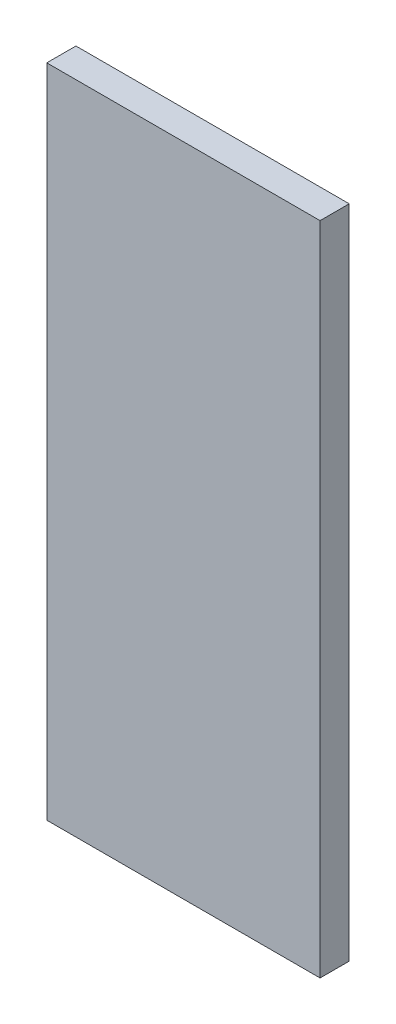
ISO-10303-21;
HEADER;
FILE_DESCRIPTION(('STEP AP214'),'2;1');
FILE_NAME('part.step','',(''),(''),'','','');
FILE_SCHEMA(('AUTOMOTIVE_DESIGN { 1 0 10303 214 1 1 1 1 }'));
ENDSEC;
DATA;
#1=APPLICATION_CONTEXT('core data for automotive mechanical design processes');
#2=APPLICATION_PROTOCOL_DEFINITION('international standard','automotive_design',2000,#1);
#3=PRODUCT_CONTEXT('',#1,'mechanical');
#4=PRODUCT('Part','Part','',(#3));
#5=PRODUCT_RELATED_PRODUCT_CATEGORY('part','',(#4));
#6=PRODUCT_DEFINITION_FORMATION('','',#4);
#7=PRODUCT_DEFINITION_CONTEXT('part definition',#1,'design');
#8=PRODUCT_DEFINITION('design','',#6,#7);
#9=PRODUCT_DEFINITION_SHAPE('','',#8);
#10=(LENGTH_UNIT() NAMED_UNIT(*) SI_UNIT(.MILLI.,.METRE.));
#11=(NAMED_UNIT(*) PLANE_ANGLE_UNIT() SI_UNIT($,.RADIAN.));
#12=(NAMED_UNIT(*) SI_UNIT($,.STERADIAN.) SOLID_ANGLE_UNIT());
#13=UNCERTAINTY_MEASURE_WITH_UNIT(LENGTH_MEASURE(1.E-05),#10,'distance_accuracy_value','');
#14=(GEOMETRIC_REPRESENTATION_CONTEXT(3) GLOBAL_UNCERTAINTY_ASSIGNED_CONTEXT((#13)) GLOBAL_UNIT_ASSIGNED_CONTEXT((#10,
#11,#12)) REPRESENTATION_CONTEXT('',''));
#15=CARTESIAN_POINT('',(0.,0.,0.));
#16=DIRECTION('',(0.,0.,1.));
#17=DIRECTION('',(1.,0.,0.));
#18=AXIS2_PLACEMENT_3D('',#15,#16,#17);
#19=CARTESIAN_POINT('',(0.,0.,-8.00000000000001));
#20=DIRECTION('',(-1.,0.,0.));
#21=DIRECTION('',(0.,-1.,0.));
#22=AXIS2_PLACEMENT_3D('',#19,#20,#21);
#23=PLANE('',#22);
#24=DIRECTION('',(0.,-1.,0.));
#25=VECTOR('',#24,1.);
#26=CARTESIAN_POINT('',(0.,0.,0.));
#27=LINE('',#26,#25);
#28=CARTESIAN_POINT('',(0.,0.,0.));
#29=VERTEX_POINT('',#28);
#30=CARTESIAN_POINT('',(0.,-180.,0.));
#31=VERTEX_POINT('',#30);
#32=EDGE_CURVE('E98',#29,#31,#27,.T.);
#33=ORIENTED_EDGE('',*,*,#32,.F.);
#34=DIRECTION('',(0.,0.,1.));
#35=VECTOR('',#34,1.);
#36=CARTESIAN_POINT('',(0.,0.,-8.00000000000001));
#37=LINE('',#36,#35);
#38=CARTESIAN_POINT('',(0.,0.,-8.00000000000001));
#39=VERTEX_POINT('',#38);
#40=EDGE_CURVE('E11',#39,#29,#37,.T.);
#41=ORIENTED_EDGE('',*,*,#40,.F.);
#42=DIRECTION('',(0.,-1.,0.));
#43=VECTOR('',#42,1.);
#44=CARTESIAN_POINT('',(0.,0.,-8.00000000000001));
#45=LINE('',#44,#43);
#46=CARTESIAN_POINT('',(0.,-180.,-8.00000000000001));
#47=VERTEX_POINT('',#46);
#48=EDGE_CURVE('E92',#39,#47,#45,.T.);
#49=ORIENTED_EDGE('',*,*,#48,.T.);
#50=DIRECTION('',(0.,0.,1.));
#51=VECTOR('',#50,1.);
#52=CARTESIAN_POINT('',(0.,-180.,-8.00000000000001));
#53=LINE('',#52,#51);
#54=EDGE_CURVE('E37',#47,#31,#53,.T.);
#55=ORIENTED_EDGE('',*,*,#54,.T.);
#56=EDGE_LOOP('',(#33,#41,#49,#55));
#57=FACE_BOUND('',#56,.T.);
#58=ADVANCED_FACE('F34',(#57),#23,.T.);
#59=CARTESIAN_POINT('',(0.,0.,-8.00000000000001));
#60=DIRECTION('',(0.,1.,0.));
#61=DIRECTION('',(0.,0.,1.));
#62=AXIS2_PLACEMENT_3D('',#59,#60,#61);
#63=PLANE('',#62);
#64=DIRECTION('',(-1.,0.,0.));
#65=VECTOR('',#64,1.);
#66=CARTESIAN_POINT('',(0.,0.,0.));
#67=LINE('',#66,#65);
#68=CARTESIAN_POINT('',(75.,0.,0.));
#69=VERTEX_POINT('',#68);
#70=EDGE_CURVE('E94',#69,#29,#67,.T.);
#71=ORIENTED_EDGE('',*,*,#70,.F.);
#72=DIRECTION('',(0.,0.,1.));
#73=VECTOR('',#72,1.);
#74=CARTESIAN_POINT('',(75.,0.,-8.00000000000001));
#75=LINE('',#74,#73);
#76=CARTESIAN_POINT('',(75.,0.,-8.00000000000001));
#77=VERTEX_POINT('',#76);
#78=EDGE_CURVE('E43',#77,#69,#75,.T.);
#79=ORIENTED_EDGE('',*,*,#78,.F.);
#80=DIRECTION('',(-1.,0.,0.));
#81=VECTOR('',#80,1.);
#82=CARTESIAN_POINT('',(0.,0.,-8.00000000000001));
#83=LINE('',#82,#81);
#84=EDGE_CURVE('E89',#77,#39,#83,.T.);
#85=ORIENTED_EDGE('',*,*,#84,.T.);
#86=ORIENTED_EDGE('',*,*,#40,.T.);
#87=EDGE_LOOP('',(#71,#79,#85,#86));
#88=FACE_BOUND('',#87,.T.);
#89=ADVANCED_FACE('F108',(#88),#63,.T.);
#90=CARTESIAN_POINT('',(75.,0.,-8.00000000000001));
#91=DIRECTION('',(1.,0.,0.));
#92=DIRECTION('',(0.,1.,0.));
#93=AXIS2_PLACEMENT_3D('',#90,#91,#92);
#94=PLANE('',#93);
#95=DIRECTION('',(0.,1.,0.));
#96=VECTOR('',#95,1.);
#97=CARTESIAN_POINT('',(75.,0.,0.));
#98=LINE('',#97,#96);
#99=CARTESIAN_POINT('',(75.,-180.,0.));
#100=VERTEX_POINT('',#99);
#101=EDGE_CURVE('E84',#100,#69,#98,.T.);
#102=ORIENTED_EDGE('',*,*,#101,.F.);
#103=DIRECTION('',(0.,0.,1.));
#104=VECTOR('',#103,1.);
#105=CARTESIAN_POINT('',(75.,-180.,-8.00000000000001));
#106=LINE('',#105,#104);
#107=CARTESIAN_POINT('',(75.,-180.,-8.00000000000001));
#108=VERTEX_POINT('',#107);
#109=EDGE_CURVE('E79',#108,#100,#106,.T.);
#110=ORIENTED_EDGE('',*,*,#109,.F.);
#111=DIRECTION('',(0.,1.,0.));
#112=VECTOR('',#111,1.);
#113=CARTESIAN_POINT('',(75.,0.,-8.00000000000001));
#114=LINE('',#113,#112);
#115=EDGE_CURVE('E82',#108,#77,#114,.T.);
#116=ORIENTED_EDGE('',*,*,#115,.T.);
#117=ORIENTED_EDGE('',*,*,#78,.T.);
#118=EDGE_LOOP('',(#102,#110,#116,#117));
#119=FACE_BOUND('',#118,.T.);
#120=ADVANCED_FACE('F81',(#119),#94,.T.);
#121=CARTESIAN_POINT('',(0.,-180.,-8.00000000000001));
#122=DIRECTION('',(0.,-1.,0.));
#123=DIRECTION('',(0.,0.,-1.));
#124=AXIS2_PLACEMENT_3D('',#121,#122,#123);
#125=PLANE('',#124);
#126=DIRECTION('',(1.,0.,0.));
#127=VECTOR('',#126,1.);
#128=CARTESIAN_POINT('',(0.,-180.,0.));
#129=LINE('',#128,#127);
#130=EDGE_CURVE('E101',#31,#100,#129,.T.);
#131=ORIENTED_EDGE('',*,*,#130,.F.);
#132=ORIENTED_EDGE('',*,*,#54,.F.);
#133=DIRECTION('',(1.,0.,0.));
#134=VECTOR('',#133,1.);
#135=CARTESIAN_POINT('',(0.,-180.,-8.00000000000001));
#136=LINE('',#135,#134);
#137=EDGE_CURVE('E88',#47,#108,#136,.T.);
#138=ORIENTED_EDGE('',*,*,#137,.T.);
#139=ORIENTED_EDGE('',*,*,#109,.T.);
#140=EDGE_LOOP('',(#131,#132,#138,#139));
#141=FACE_BOUND('',#140,.T.);
#142=ADVANCED_FACE('F91',(#141),#125,.T.);
#143=CARTESIAN_POINT('',(0.,0.,-8.00000000000001));
#144=DIRECTION('',(0.,0.,1.));
#145=DIRECTION('',(1.,0.,0.));
#146=AXIS2_PLACEMENT_3D('',#143,#144,#145);
#147=PLANE('',#146);
#148=ORIENTED_EDGE('',*,*,#48,.F.);
#149=ORIENTED_EDGE('',*,*,#84,.F.);
#150=ORIENTED_EDGE('',*,*,#115,.F.);
#151=ORIENTED_EDGE('',*,*,#137,.F.);
#152=EDGE_LOOP('',(#148,#149,#150,#151));
#153=FACE_BOUND('',#152,.T.);
#154=ADVANCED_FACE('F87',(#153),#147,.F.);
#155=CARTESIAN_POINT('',(0.,0.,0.));
#156=DIRECTION('',(0.,0.,1.));
#157=DIRECTION('',(1.,0.,0.));
#158=AXIS2_PLACEMENT_3D('',#155,#156,#157);
#159=PLANE('',#158);
#160=ORIENTED_EDGE('',*,*,#32,.T.);
#161=ORIENTED_EDGE('',*,*,#130,.T.);
#162=ORIENTED_EDGE('',*,*,#101,.T.);
#163=ORIENTED_EDGE('',*,*,#70,.T.);
#164=EDGE_LOOP('',(#160,#161,#162,#163));
#165=FACE_BOUND('',#164,.T.);
#166=ADVANCED_FACE('F107',(#165),#159,.T.);
#167=CLOSED_SHELL('',(#58,#89,#120,#142,#154,#166));
#168=MANIFOLD_SOLID_BREP('B2',#167);
#169=ADVANCED_BREP_SHAPE_REPRESENTATION('',(#18,#168),#14);
#170=SHAPE_DEFINITION_REPRESENTATION(#9,#169);
ENDSEC;
END-ISO-10303-21;
